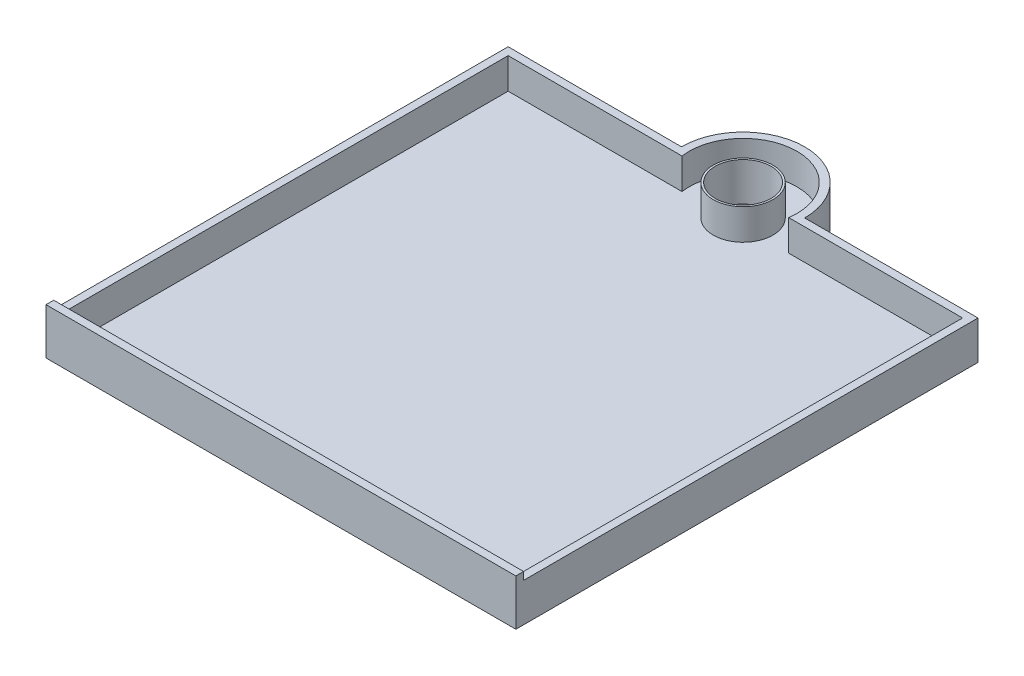
ISO-10303-21;
HEADER;
FILE_DESCRIPTION(('STEP AP214'),'2;1');
FILE_NAME('part.step','',(''),(''),'','','');
FILE_SCHEMA(('AUTOMOTIVE_DESIGN { 1 0 10303 214 1 1 1 1 }'));
ENDSEC;
DATA;
#1=APPLICATION_CONTEXT('core data for automotive mechanical design processes');
#2=APPLICATION_PROTOCOL_DEFINITION('international standard','automotive_design',2000,#1);
#3=PRODUCT_CONTEXT('',#1,'mechanical');
#4=PRODUCT('Part','Part','',(#3));
#5=PRODUCT_RELATED_PRODUCT_CATEGORY('part','',(#4));
#6=PRODUCT_DEFINITION_FORMATION('','',#4);
#7=PRODUCT_DEFINITION_CONTEXT('part definition',#1,'design');
#8=PRODUCT_DEFINITION('design','',#6,#7);
#9=PRODUCT_DEFINITION_SHAPE('','',#8);
#10=(LENGTH_UNIT() NAMED_UNIT(*) SI_UNIT(.MILLI.,.METRE.));
#11=(NAMED_UNIT(*) PLANE_ANGLE_UNIT() SI_UNIT($,.RADIAN.));
#12=(NAMED_UNIT(*) SI_UNIT($,.STERADIAN.) SOLID_ANGLE_UNIT());
#13=UNCERTAINTY_MEASURE_WITH_UNIT(LENGTH_MEASURE(1.E-05),#10,'distance_accuracy_value','');
#14=(GEOMETRIC_REPRESENTATION_CONTEXT(3) GLOBAL_UNCERTAINTY_ASSIGNED_CONTEXT((#13)) GLOBAL_UNIT_ASSIGNED_CONTEXT((#10,
#11,#12)) REPRESENTATION_CONTEXT('',''));
#15=CARTESIAN_POINT('',(0.,0.,0.));
#16=DIRECTION('',(0.,0.,1.));
#17=DIRECTION('',(1.,0.,0.));
#18=AXIS2_PLACEMENT_3D('',#15,#16,#17);
#19=CARTESIAN_POINT('',(0.,10.,0.));
#20=DIRECTION('',(0.,1.,0.));
#21=DIRECTION('',(0.,0.,1.));
#22=AXIS2_PLACEMENT_3D('',#19,#20,#21);
#23=PLANE('',#22);
#24=DIRECTION('',(0.,0.,1.));
#25=VECTOR('',#24,1.);
#26=CARTESIAN_POINT('',(-61.,10.,120.));
#27=LINE('',#26,#25);
#28=CARTESIAN_POINT('',(-61.,10.,0.));
#29=VERTEX_POINT('',#28);
#30=CARTESIAN_POINT('',(-61.,10.,118.));
#31=VERTEX_POINT('',#30);
#32=EDGE_CURVE('E47',#29,#31,#27,.T.);
#33=ORIENTED_EDGE('',*,*,#32,.T.);
#34=DIRECTION('',(1.,0.,0.));
#35=VECTOR('',#34,1.);
#36=CARTESIAN_POINT('',(0.,10.,118.));
#37=LINE('',#36,#35);
#38=CARTESIAN_POINT('',(-59.,10.,118.));
#39=VERTEX_POINT('',#38);
#40=EDGE_CURVE('E153',#31,#39,#37,.T.);
#41=ORIENTED_EDGE('',*,*,#40,.T.);
#42=DIRECTION('',(0.,0.,1.));
#43=VECTOR('',#42,1.);
#44=CARTESIAN_POINT('',(-59.,10.,2.));
#45=LINE('',#44,#43);
#46=CARTESIAN_POINT('',(-59.,10.,2.));
#47=VERTEX_POINT('',#46);
#48=EDGE_CURVE('E185',#47,#39,#45,.T.);
#49=ORIENTED_EDGE('',*,*,#48,.F.);
#50=DIRECTION('',(-1.,0.,0.));
#51=VECTOR('',#50,1.);
#52=CARTESIAN_POINT('',(-13.856406460551,10.,2.));
#53=LINE('',#52,#51);
#54=CARTESIAN_POINT('',(-13.856406460551,10.,2.));
#55=VERTEX_POINT('',#54);
#56=EDGE_CURVE('E168',#55,#47,#53,.T.);
#57=ORIENTED_EDGE('',*,*,#56,.F.);
#58=CARTESIAN_POINT('',(0.,10.,0.));
#59=DIRECTION('',(0.,1.,0.));
#60=DIRECTION('',(0.,0.,1.));
#61=AXIS2_PLACEMENT_3D('',#58,#59,#60);
#62=CIRCLE('',#61,14.);
#63=CARTESIAN_POINT('',(13.856406460551,10.,2.));
#64=VERTEX_POINT('',#63);
#65=EDGE_CURVE('E243',#64,#55,#62,.T.);
#66=ORIENTED_EDGE('',*,*,#65,.F.);
#67=DIRECTION('',(-1.,0.,0.));
#68=VECTOR('',#67,1.);
#69=CARTESIAN_POINT('',(59.,10.,2.));
#70=LINE('',#69,#68);
#71=CARTESIAN_POINT('',(59.,10.,2.));
#72=VERTEX_POINT('',#71);
#73=EDGE_CURVE('E173',#72,#64,#70,.T.);
#74=ORIENTED_EDGE('',*,*,#73,.F.);
#75=DIRECTION('',(0.,0.,-1.));
#76=VECTOR('',#75,1.);
#77=CARTESIAN_POINT('',(59.,10.,118.));
#78=LINE('',#77,#76);
#79=CARTESIAN_POINT('',(59.,10.,118.));
#80=VERTEX_POINT('',#79);
#81=EDGE_CURVE('E188',#80,#72,#78,.T.);
#82=ORIENTED_EDGE('',*,*,#81,.F.);
#83=CARTESIAN_POINT('',(61.,10.,118.));
#84=VERTEX_POINT('',#83);
#85=EDGE_CURVE('E155',#80,#84,#37,.T.);
#86=ORIENTED_EDGE('',*,*,#85,.T.);
#87=DIRECTION('',(0.,0.,-1.));
#88=VECTOR('',#87,1.);
#89=CARTESIAN_POINT('',(61.,10.,0.));
#90=LINE('',#89,#88);
#91=CARTESIAN_POINT('',(61.,10.,0.));
#92=VERTEX_POINT('',#91);
#93=EDGE_CURVE('E207',#84,#92,#90,.T.);
#94=ORIENTED_EDGE('',*,*,#93,.T.);
#95=DIRECTION('',(-1.,0.,0.));
#96=VECTOR('',#95,1.);
#97=CARTESIAN_POINT('',(16.,10.,0.));
#98=LINE('',#97,#96);
#99=CARTESIAN_POINT('',(16.,10.,0.));
#100=VERTEX_POINT('',#99);
#101=EDGE_CURVE('E209',#92,#100,#98,.T.);
#102=ORIENTED_EDGE('',*,*,#101,.T.);
#103=CARTESIAN_POINT('',(0.,10.,0.));
#104=DIRECTION('',(0.,1.,0.));
#105=DIRECTION('',(0.,0.,1.));
#106=AXIS2_PLACEMENT_3D('',#103,#104,#105);
#107=CIRCLE('',#106,16.);
#108=CARTESIAN_POINT('',(-16.,10.,0.));
#109=VERTEX_POINT('',#108);
#110=EDGE_CURVE('E11',#100,#109,#107,.T.);
#111=ORIENTED_EDGE('',*,*,#110,.T.);
#112=DIRECTION('',(-1.,0.,0.));
#113=VECTOR('',#112,1.);
#114=CARTESIAN_POINT('',(-61.,10.,0.));
#115=LINE('',#114,#113);
#116=EDGE_CURVE('E194',#109,#29,#115,.T.);
#117=ORIENTED_EDGE('',*,*,#116,.T.);
#118=EDGE_LOOP('',(#33,#41,#49,#57,#66,#74,#82,#86,#94,#102,#111,#117));
#119=FACE_BOUND('',#118,.T.);
#120=ADVANCED_FACE('F32',(#119),#23,.T.);
#121=CARTESIAN_POINT('',(0.,10.,0.));
#122=DIRECTION('',(0.,1.,0.));
#123=DIRECTION('',(0.,0.,1.));
#124=AXIS2_PLACEMENT_3D('',#121,#122,#123);
#125=CIRCLE('',#124,7.25);
#126=CARTESIAN_POINT('',(0.,10.,7.25));
#127=VERTEX_POINT('',#126);
#128=EDGE_CURVE('E251',#127,#127,#125,.T.);
#129=ORIENTED_EDGE('',*,*,#128,.F.);
#130=EDGE_LOOP('',(#129));
#131=FACE_BOUND('',#130,.T.);
#132=CARTESIAN_POINT('',(0.,10.,0.));
#133=DIRECTION('',(0.,1.,0.));
#134=DIRECTION('',(0.,0.,1.));
#135=AXIS2_PLACEMENT_3D('',#132,#133,#134);
#136=CIRCLE('',#135,7.75);
#137=CARTESIAN_POINT('',(0.,10.,7.75));
#138=VERTEX_POINT('',#137);
#139=EDGE_CURVE('E230',#138,#138,#136,.T.);
#140=ORIENTED_EDGE('',*,*,#139,.T.);
#141=EDGE_LOOP('',(#140));
#142=FACE_BOUND('',#141,.T.);
#143=ADVANCED_FACE('F274',(#131,#142),#23,.T.);
#144=CARTESIAN_POINT('',(0.,10.,0.));
#145=DIRECTION('',(0.,-1.,0.));
#146=DIRECTION('',(0.,0.,-1.));
#147=AXIS2_PLACEMENT_3D('',#144,#145,#146);
#148=CYLINDRICAL_SURFACE('',#147,16.);
#149=ORIENTED_EDGE('',*,*,#110,.F.);
#150=DIRECTION('',(0.,1.,0.));
#151=VECTOR('',#150,1.);
#152=CARTESIAN_POINT('',(16.,0.,0.));
#153=LINE('',#152,#151);
#154=CARTESIAN_POINT('',(16.,0.,0.));
#155=VERTEX_POINT('',#154);
#156=EDGE_CURVE('E227',#155,#100,#153,.T.);
#157=ORIENTED_EDGE('',*,*,#156,.F.);
#158=CARTESIAN_POINT('',(0.,0.,0.));
#159=DIRECTION('',(0.,1.,0.));
#160=DIRECTION('',(0.,0.,1.));
#161=AXIS2_PLACEMENT_3D('',#158,#159,#160);
#162=CIRCLE('',#161,16.);
#163=CARTESIAN_POINT('',(-16.,0.,0.));
#164=VERTEX_POINT('',#163);
#165=EDGE_CURVE('E36',#155,#164,#162,.T.);
#166=ORIENTED_EDGE('',*,*,#165,.T.);
#167=DIRECTION('',(0.,1.,0.));
#168=VECTOR('',#167,1.);
#169=CARTESIAN_POINT('',(-16.,0.,0.));
#170=LINE('',#169,#168);
#171=EDGE_CURVE('E226',#164,#109,#170,.T.);
#172=ORIENTED_EDGE('',*,*,#171,.T.);
#173=EDGE_LOOP('',(#149,#157,#166,#172));
#174=FACE_BOUND('',#173,.T.);
#175=ADVANCED_FACE('F34',(#174),#148,.T.);
#176=CARTESIAN_POINT('',(0.,0.,0.));
#177=DIRECTION('',(0.,1.,0.));
#178=DIRECTION('',(0.,0.,1.));
#179=AXIS2_PLACEMENT_3D('',#176,#177,#178);
#180=PLANE('',#179);
#181=CARTESIAN_POINT('',(0.,0.,0.));
#182=DIRECTION('',(0.,1.,0.));
#183=DIRECTION('',(0.,0.,1.));
#184=AXIS2_PLACEMENT_3D('',#181,#182,#183);
#185=CIRCLE('',#184,7.25);
#186=CARTESIAN_POINT('',(0.,0.,7.25));
#187=VERTEX_POINT('',#186);
#188=EDGE_CURVE('E248',#187,#187,#185,.T.);
#189=ORIENTED_EDGE('',*,*,#188,.T.);
#190=EDGE_LOOP('',(#189));
#191=FACE_BOUND('',#190,.T.);
#192=ORIENTED_EDGE('',*,*,#165,.F.);
#193=DIRECTION('',(-1.,0.,0.));
#194=VECTOR('',#193,1.);
#195=CARTESIAN_POINT('',(16.,0.,0.));
#196=LINE('',#195,#194);
#197=CARTESIAN_POINT('',(61.,0.,0.));
#198=VERTEX_POINT('',#197);
#199=EDGE_CURVE('E223',#198,#155,#196,.T.);
#200=ORIENTED_EDGE('',*,*,#199,.F.);
#201=DIRECTION('',(0.,0.,-1.));
#202=VECTOR('',#201,1.);
#203=CARTESIAN_POINT('',(61.,0.,0.));
#204=LINE('',#203,#202);
#205=CARTESIAN_POINT('',(61.,0.,120.));
#206=VERTEX_POINT('',#205);
#207=EDGE_CURVE('E220',#206,#198,#204,.T.);
#208=ORIENTED_EDGE('',*,*,#207,.F.);
#209=DIRECTION('',(1.,0.,0.));
#210=VECTOR('',#209,1.);
#211=CARTESIAN_POINT('',(61.,0.,120.));
#212=LINE('',#211,#210);
#213=CARTESIAN_POINT('',(-61.,0.,120.));
#214=VERTEX_POINT('',#213);
#215=EDGE_CURVE('E217',#214,#206,#212,.T.);
#216=ORIENTED_EDGE('',*,*,#215,.F.);
#217=DIRECTION('',(0.,0.,1.));
#218=VECTOR('',#217,1.);
#219=CARTESIAN_POINT('',(-61.,0.,120.));
#220=LINE('',#219,#218);
#221=CARTESIAN_POINT('',(-61.,0.,0.));
#222=VERTEX_POINT('',#221);
#223=EDGE_CURVE('E215',#222,#214,#220,.T.);
#224=ORIENTED_EDGE('',*,*,#223,.F.);
#225=DIRECTION('',(-1.,0.,0.));
#226=VECTOR('',#225,1.);
#227=CARTESIAN_POINT('',(-61.,0.,0.));
#228=LINE('',#227,#226);
#229=EDGE_CURVE('E212',#164,#222,#228,.T.);
#230=ORIENTED_EDGE('',*,*,#229,.F.);
#231=EDGE_LOOP('',(#192,#200,#208,#216,#224,#230));
#232=FACE_BOUND('',#231,.T.);
#233=ADVANCED_FACE('F257',(#191,#232),#180,.F.);
#234=CARTESIAN_POINT('',(0.,10.,0.));
#235=DIRECTION('',(0.,-1.,0.));
#236=DIRECTION('',(0.,0.,-1.));
#237=AXIS2_PLACEMENT_3D('',#234,#235,#236);
#238=CYLINDRICAL_SURFACE('',#237,7.25);
#239=ORIENTED_EDGE('',*,*,#128,.T.);
#240=EDGE_LOOP('',(#239));
#241=FACE_BOUND('',#240,.T.);
#242=ORIENTED_EDGE('',*,*,#188,.F.);
#243=EDGE_LOOP('',(#242));
#244=FACE_BOUND('',#243,.T.);
#245=ADVANCED_FACE('F260',(#241,#244),#238,.F.);
#246=CARTESIAN_POINT('',(0.,2.,0.));
#247=DIRECTION('',(0.,1.,0.));
#248=DIRECTION('',(0.,0.,1.));
#249=AXIS2_PLACEMENT_3D('',#246,#247,#248);
#250=CYLINDRICAL_SURFACE('',#249,14.);
#251=ORIENTED_EDGE('',*,*,#65,.T.);
#252=DIRECTION('',(0.,1.,0.));
#253=VECTOR('',#252,1.);
#254=CARTESIAN_POINT('',(-13.856406460551,2.,2.));
#255=LINE('',#254,#253);
#256=CARTESIAN_POINT('',(-13.856406460551,2.,2.));
#257=VERTEX_POINT('',#256);
#258=EDGE_CURVE('E192',#257,#55,#255,.T.);
#259=ORIENTED_EDGE('',*,*,#258,.F.);
#260=CARTESIAN_POINT('',(0.,2.,0.));
#261=DIRECTION('',(0.,1.,0.));
#262=DIRECTION('',(0.,0.,1.));
#263=AXIS2_PLACEMENT_3D('',#260,#261,#262);
#264=CIRCLE('',#263,14.);
#265=CARTESIAN_POINT('',(13.856406460551,2.,2.));
#266=VERTEX_POINT('',#265);
#267=EDGE_CURVE('E246',#266,#257,#264,.T.);
#268=ORIENTED_EDGE('',*,*,#267,.F.);
#269=DIRECTION('',(0.,1.,0.));
#270=VECTOR('',#269,1.);
#271=CARTESIAN_POINT('',(13.856406460551,2.,2.));
#272=LINE('',#271,#270);
#273=EDGE_CURVE('E195',#266,#64,#272,.T.);
#274=ORIENTED_EDGE('',*,*,#273,.T.);
#275=EDGE_LOOP('',(#251,#259,#268,#274));
#276=FACE_BOUND('',#275,.T.);
#277=ADVANCED_FACE('F262',(#276),#250,.F.);
#278=CARTESIAN_POINT('',(0.,2.,0.));
#279=DIRECTION('',(0.,1.,0.));
#280=DIRECTION('',(0.,0.,1.));
#281=AXIS2_PLACEMENT_3D('',#278,#279,#280);
#282=PLANE('',#281);
#283=CARTESIAN_POINT('',(0.,2.,0.));
#284=DIRECTION('',(0.,1.,0.));
#285=DIRECTION('',(0.,0.,1.));
#286=AXIS2_PLACEMENT_3D('',#283,#284,#285);
#287=CIRCLE('',#286,7.75);
#288=CARTESIAN_POINT('',(0.,2.,7.75));
#289=VERTEX_POINT('',#288);
#290=EDGE_CURVE('E240',#289,#289,#287,.T.);
#291=ORIENTED_EDGE('',*,*,#290,.F.);
#292=EDGE_LOOP('',(#291));
#293=FACE_BOUND('',#292,.T.);
#294=ORIENTED_EDGE('',*,*,#267,.T.);
#295=DIRECTION('',(-1.,0.,0.));
#296=VECTOR('',#295,1.);
#297=CARTESIAN_POINT('',(-13.856406460551,2.,2.));
#298=LINE('',#297,#296);
#299=CARTESIAN_POINT('',(-59.,2.,2.));
#300=VERTEX_POINT('',#299);
#301=EDGE_CURVE('E169',#257,#300,#298,.T.);
#302=ORIENTED_EDGE('',*,*,#301,.T.);
#303=DIRECTION('',(0.,0.,1.));
#304=VECTOR('',#303,1.);
#305=CARTESIAN_POINT('',(-59.,2.,2.));
#306=LINE('',#305,#304);
#307=CARTESIAN_POINT('',(-59.,2.,118.));
#308=VERTEX_POINT('',#307);
#309=EDGE_CURVE('E172',#300,#308,#306,.T.);
#310=ORIENTED_EDGE('',*,*,#309,.T.);
#311=DIRECTION('',(1.,0.,0.));
#312=VECTOR('',#311,1.);
#313=CARTESIAN_POINT('',(-59.,2.,118.));
#314=LINE('',#313,#312);
#315=CARTESIAN_POINT('',(59.,2.,118.));
#316=VERTEX_POINT('',#315);
#317=EDGE_CURVE('E176',#308,#316,#314,.T.);
#318=ORIENTED_EDGE('',*,*,#317,.T.);
#319=DIRECTION('',(0.,0.,-1.));
#320=VECTOR('',#319,1.);
#321=CARTESIAN_POINT('',(59.,2.,118.));
#322=LINE('',#321,#320);
#323=CARTESIAN_POINT('',(59.,2.,2.));
#324=VERTEX_POINT('',#323);
#325=EDGE_CURVE('E179',#316,#324,#322,.T.);
#326=ORIENTED_EDGE('',*,*,#325,.T.);
#327=DIRECTION('',(-1.,0.,0.));
#328=VECTOR('',#327,1.);
#329=CARTESIAN_POINT('',(59.,2.,2.));
#330=LINE('',#329,#328);
#331=EDGE_CURVE('E55',#324,#266,#330,.T.);
#332=ORIENTED_EDGE('',*,*,#331,.T.);
#333=EDGE_LOOP('',(#294,#302,#310,#318,#326,#332));
#334=FACE_BOUND('',#333,.T.);
#335=ADVANCED_FACE('F269',(#293,#334),#282,.T.);
#336=CARTESIAN_POINT('',(0.,2.,0.));
#337=DIRECTION('',(0.,1.,0.));
#338=DIRECTION('',(0.,0.,1.));
#339=AXIS2_PLACEMENT_3D('',#336,#337,#338);
#340=CYLINDRICAL_SURFACE('',#339,7.75);
#341=ORIENTED_EDGE('',*,*,#290,.T.);
#342=EDGE_LOOP('',(#341));
#343=FACE_BOUND('',#342,.T.);
#344=ORIENTED_EDGE('',*,*,#139,.F.);
#345=EDGE_LOOP('',(#344));
#346=FACE_BOUND('',#345,.T.);
#347=ADVANCED_FACE('F287',(#343,#346),#340,.T.);
#348=CARTESIAN_POINT('',(16.,0.,0.));
#349=DIRECTION('',(0.,0.,-1.));
#350=DIRECTION('',(-1.,0.,0.));
#351=AXIS2_PLACEMENT_3D('',#348,#349,#350);
#352=PLANE('',#351);
#353=ORIENTED_EDGE('',*,*,#156,.T.);
#354=ORIENTED_EDGE('',*,*,#101,.F.);
#355=DIRECTION('',(0.,1.,0.));
#356=VECTOR('',#355,1.);
#357=CARTESIAN_POINT('',(61.,0.,0.));
#358=LINE('',#357,#356);
#359=EDGE_CURVE('E231',#198,#92,#358,.T.);
#360=ORIENTED_EDGE('',*,*,#359,.F.);
#361=ORIENTED_EDGE('',*,*,#199,.T.);
#362=EDGE_LOOP('',(#353,#354,#360,#361));
#363=FACE_BOUND('',#362,.T.);
#364=ADVANCED_FACE('F289',(#363),#352,.T.);
#365=CARTESIAN_POINT('',(61.,0.,0.));
#366=DIRECTION('',(1.,0.,0.));
#367=DIRECTION('',(0.,0.,-1.));
#368=AXIS2_PLACEMENT_3D('',#365,#366,#367);
#369=PLANE('',#368);
#370=ORIENTED_EDGE('',*,*,#93,.F.);
#371=DIRECTION('',(0.,-1.,0.));
#372=VECTOR('',#371,1.);
#373=CARTESIAN_POINT('',(61.,12.,118.));
#374=LINE('',#373,#372);
#375=CARTESIAN_POINT('',(61.,12.,118.));
#376=VERTEX_POINT('',#375);
#377=EDGE_CURVE('E156',#376,#84,#374,.T.);
#378=ORIENTED_EDGE('',*,*,#377,.F.);
#379=DIRECTION('',(0.,0.,-1.));
#380=VECTOR('',#379,1.);
#381=CARTESIAN_POINT('',(61.,12.,120.));
#382=LINE('',#381,#380);
#383=CARTESIAN_POINT('',(61.,12.,120.));
#384=VERTEX_POINT('',#383);
#385=EDGE_CURVE('E144',#384,#376,#382,.T.);
#386=ORIENTED_EDGE('',*,*,#385,.F.);
#387=DIRECTION('',(0.,1.,0.));
#388=VECTOR('',#387,1.);
#389=CARTESIAN_POINT('',(61.,0.,120.));
#390=LINE('',#389,#388);
#391=EDGE_CURVE('E234',#206,#384,#390,.T.);
#392=ORIENTED_EDGE('',*,*,#391,.F.);
#393=ORIENTED_EDGE('',*,*,#207,.T.);
#394=ORIENTED_EDGE('',*,*,#359,.T.);
#395=EDGE_LOOP('',(#370,#378,#386,#392,#393,#394));
#396=FACE_BOUND('',#395,.T.);
#397=ADVANCED_FACE('F296',(#396),#369,.T.);
#398=CARTESIAN_POINT('',(61.,0.,120.));
#399=DIRECTION('',(0.,0.,1.));
#400=DIRECTION('',(1.,0.,0.));
#401=AXIS2_PLACEMENT_3D('',#398,#399,#400);
#402=PLANE('',#401);
#403=DIRECTION('',(1.,0.,0.));
#404=VECTOR('',#403,1.);
#405=CARTESIAN_POINT('',(-61.,12.,120.));
#406=LINE('',#405,#404);
#407=CARTESIAN_POINT('',(-61.,12.,120.));
#408=VERTEX_POINT('',#407);
#409=EDGE_CURVE('E161',#408,#384,#406,.T.);
#410=ORIENTED_EDGE('',*,*,#409,.F.);
#411=DIRECTION('',(0.,1.,0.));
#412=VECTOR('',#411,1.);
#413=CARTESIAN_POINT('',(-61.,0.,120.));
#414=LINE('',#413,#412);
#415=EDGE_CURVE('E160',#214,#408,#414,.T.);
#416=ORIENTED_EDGE('',*,*,#415,.F.);
#417=ORIENTED_EDGE('',*,*,#215,.T.);
#418=ORIENTED_EDGE('',*,*,#391,.T.);
#419=EDGE_LOOP('',(#410,#416,#417,#418));
#420=FACE_BOUND('',#419,.T.);
#421=ADVANCED_FACE('F309',(#420),#402,.T.);
#422=CARTESIAN_POINT('',(-61.,0.,120.));
#423=DIRECTION('',(-1.,0.,0.));
#424=DIRECTION('',(0.,0.,1.));
#425=AXIS2_PLACEMENT_3D('',#422,#423,#424);
#426=PLANE('',#425);
#427=ORIENTED_EDGE('',*,*,#415,.T.);
#428=DIRECTION('',(0.,0.,1.));
#429=VECTOR('',#428,1.);
#430=CARTESIAN_POINT('',(-61.,12.,118.));
#431=LINE('',#430,#429);
#432=CARTESIAN_POINT('',(-61.,12.,118.));
#433=VERTEX_POINT('',#432);
#434=EDGE_CURVE('E141',#433,#408,#431,.T.);
#435=ORIENTED_EDGE('',*,*,#434,.F.);
#436=DIRECTION('',(0.,-1.,0.));
#437=VECTOR('',#436,1.);
#438=CARTESIAN_POINT('',(-61.,12.,118.));
#439=LINE('',#438,#437);
#440=EDGE_CURVE('E150',#433,#31,#439,.T.);
#441=ORIENTED_EDGE('',*,*,#440,.T.);
#442=ORIENTED_EDGE('',*,*,#32,.F.);
#443=DIRECTION('',(0.,1.,0.));
#444=VECTOR('',#443,1.);
#445=CARTESIAN_POINT('',(-61.,0.,0.));
#446=LINE('',#445,#444);
#447=EDGE_CURVE('E237',#222,#29,#446,.T.);
#448=ORIENTED_EDGE('',*,*,#447,.F.);
#449=ORIENTED_EDGE('',*,*,#223,.T.);
#450=EDGE_LOOP('',(#427,#435,#441,#442,#448,#449));
#451=FACE_BOUND('',#450,.T.);
#452=ADVANCED_FACE('F158',(#451),#426,.T.);
#453=CARTESIAN_POINT('',(-61.,0.,0.));
#454=DIRECTION('',(0.,0.,-1.));
#455=DIRECTION('',(-1.,0.,0.));
#456=AXIS2_PLACEMENT_3D('',#453,#454,#455);
#457=PLANE('',#456);
#458=ORIENTED_EDGE('',*,*,#447,.T.);
#459=ORIENTED_EDGE('',*,*,#116,.F.);
#460=ORIENTED_EDGE('',*,*,#171,.F.);
#461=ORIENTED_EDGE('',*,*,#229,.T.);
#462=EDGE_LOOP('',(#458,#459,#460,#461));
#463=FACE_BOUND('',#462,.T.);
#464=ADVANCED_FACE('F302',(#463),#457,.T.);
#465=CARTESIAN_POINT('',(-13.856406460551,2.,2.));
#466=DIRECTION('',(0.,0.,-1.));
#467=DIRECTION('',(-1.,0.,0.));
#468=AXIS2_PLACEMENT_3D('',#465,#466,#467);
#469=PLANE('',#468);
#470=ORIENTED_EDGE('',*,*,#56,.T.);
#471=DIRECTION('',(0.,1.,0.));
#472=VECTOR('',#471,1.);
#473=CARTESIAN_POINT('',(-59.,2.,2.));
#474=LINE('',#473,#472);
#475=EDGE_CURVE('E182',#300,#47,#474,.T.);
#476=ORIENTED_EDGE('',*,*,#475,.F.);
#477=ORIENTED_EDGE('',*,*,#301,.F.);
#478=ORIENTED_EDGE('',*,*,#258,.T.);
#479=EDGE_LOOP('',(#470,#476,#477,#478));
#480=FACE_BOUND('',#479,.T.);
#481=ADVANCED_FACE('F305',(#480),#469,.F.);
#482=CARTESIAN_POINT('',(59.,2.,2.));
#483=DIRECTION('',(0.,0.,-1.));
#484=DIRECTION('',(-1.,0.,0.));
#485=AXIS2_PLACEMENT_3D('',#482,#483,#484);
#486=PLANE('',#485);
#487=ORIENTED_EDGE('',*,*,#73,.T.);
#488=ORIENTED_EDGE('',*,*,#273,.F.);
#489=ORIENTED_EDGE('',*,*,#331,.F.);
#490=DIRECTION('',(0.,1.,0.));
#491=VECTOR('',#490,1.);
#492=CARTESIAN_POINT('',(59.,2.,2.));
#493=LINE('',#492,#491);
#494=EDGE_CURVE('E198',#324,#72,#493,.T.);
#495=ORIENTED_EDGE('',*,*,#494,.T.);
#496=EDGE_LOOP('',(#487,#488,#489,#495));
#497=FACE_BOUND('',#496,.T.);
#498=ADVANCED_FACE('F318',(#497),#486,.F.);
#499=CARTESIAN_POINT('',(59.,2.,118.));
#500=DIRECTION('',(1.,0.,0.));
#501=DIRECTION('',(0.,0.,-1.));
#502=AXIS2_PLACEMENT_3D('',#499,#500,#501);
#503=PLANE('',#502);
#504=ORIENTED_EDGE('',*,*,#81,.T.);
#505=ORIENTED_EDGE('',*,*,#494,.F.);
#506=ORIENTED_EDGE('',*,*,#325,.F.);
#507=DIRECTION('',(0.,1.,0.));
#508=VECTOR('',#507,1.);
#509=CARTESIAN_POINT('',(59.,2.,118.));
#510=LINE('',#509,#508);
#511=EDGE_CURVE('E200',#316,#80,#510,.T.);
#512=ORIENTED_EDGE('',*,*,#511,.T.);
#513=EDGE_LOOP('',(#504,#505,#506,#512));
#514=FACE_BOUND('',#513,.T.);
#515=ADVANCED_FACE('F326',(#514),#503,.F.);
#516=CARTESIAN_POINT('',(-59.,2.,118.));
#517=DIRECTION('',(0.,0.,1.));
#518=DIRECTION('',(1.,0.,0.));
#519=AXIS2_PLACEMENT_3D('',#516,#517,#518);
#520=PLANE('',#519);
#521=DIRECTION('',(0.,1.,0.));
#522=VECTOR('',#521,1.);
#523=CARTESIAN_POINT('',(-59.,2.,118.));
#524=LINE('',#523,#522);
#525=EDGE_CURVE('E202',#308,#39,#524,.T.);
#526=ORIENTED_EDGE('',*,*,#525,.T.);
#527=ORIENTED_EDGE('',*,*,#40,.F.);
#528=ORIENTED_EDGE('',*,*,#440,.F.);
#529=DIRECTION('',(-1.,0.,0.));
#530=VECTOR('',#529,1.);
#531=CARTESIAN_POINT('',(61.,12.,118.));
#532=LINE('',#531,#530);
#533=EDGE_CURVE('E136',#376,#433,#532,.T.);
#534=ORIENTED_EDGE('',*,*,#533,.F.);
#535=ORIENTED_EDGE('',*,*,#377,.T.);
#536=ORIENTED_EDGE('',*,*,#85,.F.);
#537=ORIENTED_EDGE('',*,*,#511,.F.);
#538=ORIENTED_EDGE('',*,*,#317,.F.);
#539=EDGE_LOOP('',(#526,#527,#528,#534,#535,#536,#537,#538));
#540=FACE_BOUND('',#539,.T.);
#541=ADVANCED_FACE('F152',(#540),#520,.F.);
#542=CARTESIAN_POINT('',(-59.,2.,2.));
#543=DIRECTION('',(-1.,0.,0.));
#544=DIRECTION('',(0.,0.,1.));
#545=AXIS2_PLACEMENT_3D('',#542,#543,#544);
#546=PLANE('',#545);
#547=ORIENTED_EDGE('',*,*,#48,.T.);
#548=ORIENTED_EDGE('',*,*,#525,.F.);
#549=ORIENTED_EDGE('',*,*,#309,.F.);
#550=ORIENTED_EDGE('',*,*,#475,.T.);
#551=EDGE_LOOP('',(#547,#548,#549,#550));
#552=FACE_BOUND('',#551,.T.);
#553=ADVANCED_FACE('F320',(#552),#546,.F.);
#554=CARTESIAN_POINT('',(0.,12.,0.));
#555=DIRECTION('',(0.,1.,0.));
#556=DIRECTION('',(0.,0.,1.));
#557=AXIS2_PLACEMENT_3D('',#554,#555,#556);
#558=PLANE('',#557);
#559=ORIENTED_EDGE('',*,*,#533,.T.);
#560=ORIENTED_EDGE('',*,*,#434,.T.);
#561=ORIENTED_EDGE('',*,*,#409,.T.);
#562=ORIENTED_EDGE('',*,*,#385,.T.);
#563=EDGE_LOOP('',(#559,#560,#561,#562));
#564=FACE_BOUND('',#563,.T.);
#565=ADVANCED_FACE('F138',(#564),#558,.T.);
#566=CLOSED_SHELL('',(#120,#143,#175,#233,#245,#277,#335,#347,#364,#397,#421,#452,#464,#481,
#498,#515,#541,#553,#565));
#567=MANIFOLD_SOLID_BREP('B2',#566);
#568=ADVANCED_BREP_SHAPE_REPRESENTATION('',(#18,#567),#14);
#569=SHAPE_DEFINITION_REPRESENTATION(#9,#568);
ENDSEC;
END-ISO-10303-21;
